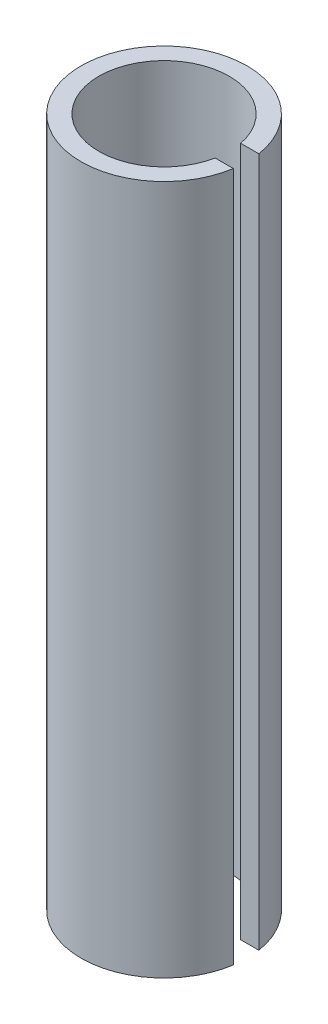
ISO-10303-21;
HEADER;
FILE_DESCRIPTION(('STEP AP214'),'2;1');
FILE_NAME('part.step','',(''),(''),'','','');
FILE_SCHEMA(('AUTOMOTIVE_DESIGN { 1 0 10303 214 1 1 1 1 }'));
ENDSEC;
DATA;
#1=APPLICATION_CONTEXT('core data for automotive mechanical design processes');
#2=APPLICATION_PROTOCOL_DEFINITION('international standard','automotive_design',2000,#1);
#3=PRODUCT_CONTEXT('',#1,'mechanical');
#4=PRODUCT('Part','Part','',(#3));
#5=PRODUCT_RELATED_PRODUCT_CATEGORY('part','',(#4));
#6=PRODUCT_DEFINITION_FORMATION('','',#4);
#7=PRODUCT_DEFINITION_CONTEXT('part definition',#1,'design');
#8=PRODUCT_DEFINITION('design','',#6,#7);
#9=PRODUCT_DEFINITION_SHAPE('','',#8);
#10=(LENGTH_UNIT() NAMED_UNIT(*) SI_UNIT(.MILLI.,.METRE.));
#11=(NAMED_UNIT(*) PLANE_ANGLE_UNIT() SI_UNIT($,.RADIAN.));
#12=(NAMED_UNIT(*) SI_UNIT($,.STERADIAN.) SOLID_ANGLE_UNIT());
#13=UNCERTAINTY_MEASURE_WITH_UNIT(LENGTH_MEASURE(1.E-05),#10,'distance_accuracy_value','');
#14=(GEOMETRIC_REPRESENTATION_CONTEXT(3) GLOBAL_UNCERTAINTY_ASSIGNED_CONTEXT((#13)) GLOBAL_UNIT_ASSIGNED_CONTEXT((#10,
#11,#12)) REPRESENTATION_CONTEXT('',''));
#15=CARTESIAN_POINT('',(0.,0.,0.));
#16=DIRECTION('',(0.,0.,1.));
#17=DIRECTION('',(1.,0.,0.));
#18=AXIS2_PLACEMENT_3D('',#15,#16,#17);
#19=CARTESIAN_POINT('',(0.,27.,0.));
#20=DIRECTION('',(0.,-1.,0.));
#21=DIRECTION('',(0.,0.,-1.));
#22=AXIS2_PLACEMENT_3D('',#19,#20,#21);
#23=CYLINDRICAL_SURFACE('',#22,2.55);
#24=CARTESIAN_POINT('',(0.,0.,0.));
#25=DIRECTION('',(0.,1.,0.));
#26=DIRECTION('',(0.,0.,1.));
#27=AXIS2_PLACEMENT_3D('',#24,#25,#26);
#28=CIRCLE('',#27,2.55);
#29=CARTESIAN_POINT('',(2.50049995001,0.,-0.5));
#30=VERTEX_POINT('',#29);
#31=CARTESIAN_POINT('',(2.50049995001,0.,0.5));
#32=VERTEX_POINT('',#31);
#33=EDGE_CURVE('E103',#30,#32,#28,.T.);
#34=ORIENTED_EDGE('',*,*,#33,.F.);
#35=DIRECTION('',(0.,-1.,0.));
#36=VECTOR('',#35,1.);
#37=CARTESIAN_POINT('',(2.50049995001,27.,-0.5));
#38=LINE('',#37,#36);
#39=CARTESIAN_POINT('',(2.50049995001,27.,-0.5));
#40=VERTEX_POINT('',#39);
#41=EDGE_CURVE('E11',#40,#30,#38,.T.);
#42=ORIENTED_EDGE('',*,*,#41,.F.);
#43=CARTESIAN_POINT('',(0.,27.,0.));
#44=DIRECTION('',(0.,1.,0.));
#45=DIRECTION('',(0.,0.,1.));
#46=AXIS2_PLACEMENT_3D('',#43,#44,#45);
#47=CIRCLE('',#46,2.55);
#48=CARTESIAN_POINT('',(2.50049995001,27.,0.5));
#49=VERTEX_POINT('',#48);
#50=EDGE_CURVE('E88',#40,#49,#47,.T.);
#51=ORIENTED_EDGE('',*,*,#50,.T.);
#52=DIRECTION('',(0.,-1.,0.));
#53=VECTOR('',#52,1.);
#54=CARTESIAN_POINT('',(2.50049995001,27.,0.5));
#55=LINE('',#54,#53);
#56=EDGE_CURVE('E56',#49,#32,#55,.T.);
#57=ORIENTED_EDGE('',*,*,#56,.T.);
#58=EDGE_LOOP('',(#34,#42,#51,#57));
#59=FACE_BOUND('',#58,.T.);
#60=ADVANCED_FACE('F40',(#59),#23,.F.);
#61=CARTESIAN_POINT('',(0.,27.,-0.5));
#62=DIRECTION('',(0.,0.,-1.));
#63=DIRECTION('',(-1.,0.,0.));
#64=AXIS2_PLACEMENT_3D('',#61,#62,#63);
#65=PLANE('',#64);
#66=DIRECTION('',(1.,0.,0.));
#67=VECTOR('',#66,1.);
#68=CARTESIAN_POINT('',(0.,0.,-0.5));
#69=LINE('',#68,#67);
#70=CARTESIAN_POINT('',(3.21130814466628,0.,-0.5));
#71=VERTEX_POINT('',#70);
#72=EDGE_CURVE('E94',#30,#71,#69,.T.);
#73=ORIENTED_EDGE('',*,*,#72,.T.);
#74=DIRECTION('',(0.,-1.,0.));
#75=VECTOR('',#74,1.);
#76=CARTESIAN_POINT('',(3.21130814466628,27.,-0.5));
#77=LINE('',#76,#75);
#78=CARTESIAN_POINT('',(3.21130814466628,27.,-0.5));
#79=VERTEX_POINT('',#78);
#80=EDGE_CURVE('E48',#79,#71,#77,.T.);
#81=ORIENTED_EDGE('',*,*,#80,.F.);
#82=DIRECTION('',(1.,0.,0.));
#83=VECTOR('',#82,1.);
#84=CARTESIAN_POINT('',(0.,27.,-0.5));
#85=LINE('',#84,#83);
#86=EDGE_CURVE('E82',#40,#79,#85,.T.);
#87=ORIENTED_EDGE('',*,*,#86,.F.);
#88=ORIENTED_EDGE('',*,*,#41,.T.);
#89=EDGE_LOOP('',(#73,#81,#87,#88));
#90=FACE_BOUND('',#89,.T.);
#91=ADVANCED_FACE('F92',(#90),#65,.F.);
#92=CARTESIAN_POINT('',(0.,27.,0.));
#93=DIRECTION('',(0.,-1.,0.));
#94=DIRECTION('',(0.,0.,-1.));
#95=AXIS2_PLACEMENT_3D('',#92,#93,#94);
#96=CYLINDRICAL_SURFACE('',#95,3.25);
#97=CARTESIAN_POINT('',(0.,0.,0.));
#98=DIRECTION('',(0.,1.,0.));
#99=DIRECTION('',(0.,0.,1.));
#100=AXIS2_PLACEMENT_3D('',#97,#98,#99);
#101=CIRCLE('',#100,3.25);
#102=CARTESIAN_POINT('',(3.21130814466628,0.,0.5));
#103=VERTEX_POINT('',#102);
#104=EDGE_CURVE('E106',#71,#103,#101,.T.);
#105=ORIENTED_EDGE('',*,*,#104,.T.);
#106=DIRECTION('',(0.,-1.,0.));
#107=VECTOR('',#106,1.);
#108=CARTESIAN_POINT('',(3.21130814466628,27.,0.5));
#109=LINE('',#108,#107);
#110=CARTESIAN_POINT('',(3.21130814466628,27.,0.5));
#111=VERTEX_POINT('',#110);
#112=EDGE_CURVE('E70',#111,#103,#109,.T.);
#113=ORIENTED_EDGE('',*,*,#112,.F.);
#114=CARTESIAN_POINT('',(0.,27.,0.));
#115=DIRECTION('',(0.,1.,0.));
#116=DIRECTION('',(0.,0.,1.));
#117=AXIS2_PLACEMENT_3D('',#114,#115,#116);
#118=CIRCLE('',#117,3.25);
#119=EDGE_CURVE('E87',#79,#111,#118,.T.);
#120=ORIENTED_EDGE('',*,*,#119,.F.);
#121=ORIENTED_EDGE('',*,*,#80,.T.);
#122=EDGE_LOOP('',(#105,#113,#120,#121));
#123=FACE_BOUND('',#122,.T.);
#124=ADVANCED_FACE('F97',(#123),#96,.T.);
#125=CARTESIAN_POINT('',(0.,27.,0.5));
#126=DIRECTION('',(0.,0.,-1.));
#127=DIRECTION('',(-1.,0.,0.));
#128=AXIS2_PLACEMENT_3D('',#125,#126,#127);
#129=PLANE('',#128);
#130=DIRECTION('',(1.,0.,0.));
#131=VECTOR('',#130,1.);
#132=CARTESIAN_POINT('',(0.,0.,0.5));
#133=LINE('',#132,#131);
#134=EDGE_CURVE('E108',#32,#103,#133,.T.);
#135=ORIENTED_EDGE('',*,*,#134,.F.);
#136=ORIENTED_EDGE('',*,*,#56,.F.);
#137=DIRECTION('',(1.,0.,0.));
#138=VECTOR('',#137,1.);
#139=CARTESIAN_POINT('',(0.,27.,0.5));
#140=LINE('',#139,#138);
#141=EDGE_CURVE('E98',#49,#111,#140,.T.);
#142=ORIENTED_EDGE('',*,*,#141,.T.);
#143=ORIENTED_EDGE('',*,*,#112,.T.);
#144=EDGE_LOOP('',(#135,#136,#142,#143));
#145=FACE_BOUND('',#144,.T.);
#146=ADVANCED_FACE('F113',(#145),#129,.T.);
#147=CARTESIAN_POINT('',(0.,27.,0.));
#148=DIRECTION('',(0.,1.,0.));
#149=DIRECTION('',(0.,0.,1.));
#150=AXIS2_PLACEMENT_3D('',#147,#148,#149);
#151=PLANE('',#150);
#152=ORIENTED_EDGE('',*,*,#50,.F.);
#153=ORIENTED_EDGE('',*,*,#86,.T.);
#154=ORIENTED_EDGE('',*,*,#119,.T.);
#155=ORIENTED_EDGE('',*,*,#141,.F.);
#156=EDGE_LOOP('',(#152,#153,#154,#155));
#157=FACE_BOUND('',#156,.T.);
#158=ADVANCED_FACE('F84',(#157),#151,.T.);
#159=CARTESIAN_POINT('',(0.,0.,0.));
#160=DIRECTION('',(0.,1.,0.));
#161=DIRECTION('',(0.,0.,1.));
#162=AXIS2_PLACEMENT_3D('',#159,#160,#161);
#163=PLANE('',#162);
#164=ORIENTED_EDGE('',*,*,#33,.T.);
#165=ORIENTED_EDGE('',*,*,#134,.T.);
#166=ORIENTED_EDGE('',*,*,#104,.F.);
#167=ORIENTED_EDGE('',*,*,#72,.F.);
#168=EDGE_LOOP('',(#164,#165,#166,#167));
#169=FACE_BOUND('',#168,.T.);
#170=ADVANCED_FACE('F120',(#169),#163,.F.);
#171=CLOSED_SHELL('',(#60,#91,#124,#146,#158,#170));
#172=MANIFOLD_SOLID_BREP('B2',#171);
#173=ADVANCED_BREP_SHAPE_REPRESENTATION('',(#18,#172),#14);
#174=SHAPE_DEFINITION_REPRESENTATION(#9,#173);
ENDSEC;
END-ISO-10303-21;
